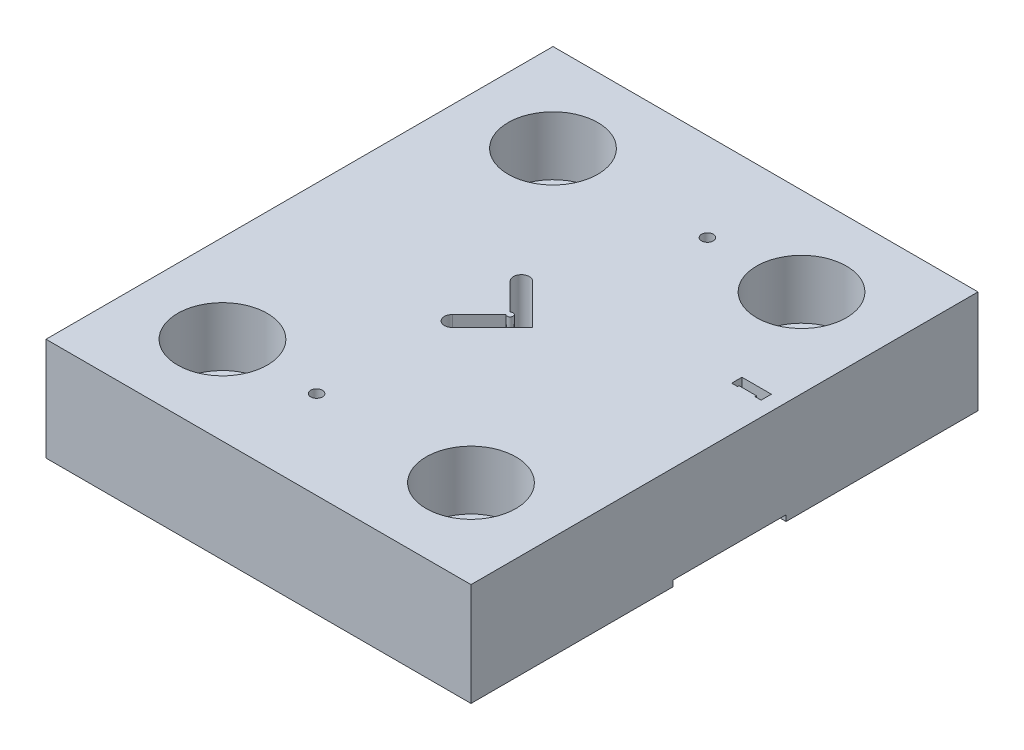
ISO-10303-21;
HEADER;
FILE_DESCRIPTION(('STEP AP214'),'2;1');
FILE_NAME('part.step','',(''),(''),'','','');
FILE_SCHEMA(('AUTOMOTIVE_DESIGN { 1 0 10303 214 1 1 1 1 }'));
ENDSEC;
DATA;
#1=APPLICATION_CONTEXT('core data for automotive mechanical design processes');
#2=APPLICATION_PROTOCOL_DEFINITION('international standard','automotive_design',2000,#1);
#3=PRODUCT_CONTEXT('',#1,'mechanical');
#4=PRODUCT('Part','Part','',(#3));
#5=PRODUCT_RELATED_PRODUCT_CATEGORY('part','',(#4));
#6=PRODUCT_DEFINITION_FORMATION('','',#4);
#7=PRODUCT_DEFINITION_CONTEXT('part definition',#1,'design');
#8=PRODUCT_DEFINITION('design','',#6,#7);
#9=PRODUCT_DEFINITION_SHAPE('','',#8);
#10=(LENGTH_UNIT() NAMED_UNIT(*) SI_UNIT(.MILLI.,.METRE.));
#11=(NAMED_UNIT(*) PLANE_ANGLE_UNIT() SI_UNIT($,.RADIAN.));
#12=(NAMED_UNIT(*) SI_UNIT($,.STERADIAN.) SOLID_ANGLE_UNIT());
#13=UNCERTAINTY_MEASURE_WITH_UNIT(LENGTH_MEASURE(1.E-05),#10,'distance_accuracy_value','');
#14=(GEOMETRIC_REPRESENTATION_CONTEXT(3) GLOBAL_UNCERTAINTY_ASSIGNED_CONTEXT((#13)) GLOBAL_UNIT_ASSIGNED_CONTEXT((#10,
#11,#12)) REPRESENTATION_CONTEXT('',''));
#15=CARTESIAN_POINT('',(0.,0.,0.));
#16=DIRECTION('',(0.,0.,1.));
#17=DIRECTION('',(1.,0.,0.));
#18=AXIS2_PLACEMENT_3D('',#15,#16,#17);
#19=CARTESIAN_POINT('',(42.25,35.001,56.19));
#20=DIRECTION('',(0.,-1.,0.));
#21=DIRECTION('',(0.,0.,-1.));
#22=AXIS2_PLACEMENT_3D('',#19,#20,#21);
#23=CYLINDRICAL_SURFACE('',#22,10.5);
#24=CARTESIAN_POINT('',(42.25,0.,56.19));
#25=DIRECTION('',(0.,-1.,0.));
#26=DIRECTION('',(0.,0.,-1.));
#27=AXIS2_PLACEMENT_3D('',#24,#25,#26);
#28=CIRCLE('',#27,10.5);
#29=CARTESIAN_POINT('',(42.25,0.,45.69));
#30=VERTEX_POINT('',#29);
#31=EDGE_CURVE('E277',#30,#30,#28,.T.);
#32=ORIENTED_EDGE('',*,*,#31,.T.);
#33=EDGE_LOOP('',(#32));
#34=FACE_BOUND('',#33,.T.);
#35=CARTESIAN_POINT('',(42.25,15.,56.19));
#36=DIRECTION('',(0.,1.,0.));
#37=DIRECTION('',(0.,0.,1.));
#38=AXIS2_PLACEMENT_3D('',#35,#36,#37);
#39=CIRCLE('',#38,10.5);
#40=CARTESIAN_POINT('',(42.25,15.,66.69));
#41=VERTEX_POINT('',#40);
#42=EDGE_CURVE('E42',#41,#41,#39,.F.);
#43=ORIENTED_EDGE('',*,*,#42,.F.);
#44=EDGE_LOOP('',(#43));
#45=FACE_BOUND('',#44,.T.);
#46=ADVANCED_FACE('F38',(#34,#45),#23,.F.);
#47=CARTESIAN_POINT('',(-42.25,35.001,56.19));
#48=DIRECTION('',(0.,-1.,0.));
#49=DIRECTION('',(0.,0.,-1.));
#50=AXIS2_PLACEMENT_3D('',#47,#48,#49);
#51=CYLINDRICAL_SURFACE('',#50,10.5);
#52=CARTESIAN_POINT('',(-42.25,0.,56.19));
#53=DIRECTION('',(0.,-1.,0.));
#54=DIRECTION('',(0.,0.,-1.));
#55=AXIS2_PLACEMENT_3D('',#52,#53,#54);
#56=CIRCLE('',#55,10.5);
#57=CARTESIAN_POINT('',(-42.25,0.,45.69));
#58=VERTEX_POINT('',#57);
#59=EDGE_CURVE('E379',#58,#58,#56,.T.);
#60=ORIENTED_EDGE('',*,*,#59,.T.);
#61=EDGE_LOOP('',(#60));
#62=FACE_BOUND('',#61,.T.);
#63=CARTESIAN_POINT('',(-42.25,15.,56.19));
#64=DIRECTION('',(0.,1.,0.));
#65=DIRECTION('',(0.,0.,1.));
#66=AXIS2_PLACEMENT_3D('',#63,#64,#65);
#67=CIRCLE('',#66,10.5);
#68=CARTESIAN_POINT('',(-42.25,15.,66.69));
#69=VERTEX_POINT('',#68);
#70=EDGE_CURVE('E429',#69,#69,#67,.F.);
#71=ORIENTED_EDGE('',*,*,#70,.F.);
#72=EDGE_LOOP('',(#71));
#73=FACE_BOUND('',#72,.T.);
#74=ADVANCED_FACE('F439',(#62,#73),#51,.F.);
#75=CARTESIAN_POINT('',(42.25,35.001,-56.19));
#76=DIRECTION('',(0.,-1.,0.));
#77=DIRECTION('',(0.,0.,-1.));
#78=AXIS2_PLACEMENT_3D('',#75,#76,#77);
#79=CYLINDRICAL_SURFACE('',#78,10.5);
#80=CARTESIAN_POINT('',(42.25,0.,-56.19));
#81=DIRECTION('',(0.,-1.,0.));
#82=DIRECTION('',(0.,0.,-1.));
#83=AXIS2_PLACEMENT_3D('',#80,#81,#82);
#84=CIRCLE('',#83,10.5);
#85=CARTESIAN_POINT('',(42.25,0.,-66.69));
#86=VERTEX_POINT('',#85);
#87=EDGE_CURVE('E376',#86,#86,#84,.T.);
#88=ORIENTED_EDGE('',*,*,#87,.T.);
#89=EDGE_LOOP('',(#88));
#90=FACE_BOUND('',#89,.T.);
#91=CARTESIAN_POINT('',(42.25,15.,-56.19));
#92=DIRECTION('',(0.,1.,0.));
#93=DIRECTION('',(0.,0.,1.));
#94=AXIS2_PLACEMENT_3D('',#91,#92,#93);
#95=CIRCLE('',#94,10.5);
#96=CARTESIAN_POINT('',(42.25,15.,-45.69));
#97=VERTEX_POINT('',#96);
#98=EDGE_CURVE('E426',#97,#97,#95,.F.);
#99=ORIENTED_EDGE('',*,*,#98,.F.);
#100=EDGE_LOOP('',(#99));
#101=FACE_BOUND('',#100,.T.);
#102=ADVANCED_FACE('F445',(#90,#101),#79,.F.);
#103=CARTESIAN_POINT('',(-42.25,35.001,-56.19));
#104=DIRECTION('',(0.,-1.,0.));
#105=DIRECTION('',(0.,0.,-1.));
#106=AXIS2_PLACEMENT_3D('',#103,#104,#105);
#107=CYLINDRICAL_SURFACE('',#106,10.5);
#108=CARTESIAN_POINT('',(-42.25,0.,-56.19));
#109=DIRECTION('',(0.,-1.,0.));
#110=DIRECTION('',(0.,0.,-1.));
#111=AXIS2_PLACEMENT_3D('',#108,#109,#110);
#112=CIRCLE('',#111,10.5);
#113=CARTESIAN_POINT('',(-42.25,0.,-66.69));
#114=VERTEX_POINT('',#113);
#115=EDGE_CURVE('E372',#114,#114,#112,.T.);
#116=ORIENTED_EDGE('',*,*,#115,.T.);
#117=EDGE_LOOP('',(#116));
#118=FACE_BOUND('',#117,.T.);
#119=CARTESIAN_POINT('',(-42.25,15.,-56.19));
#120=DIRECTION('',(0.,1.,0.));
#121=DIRECTION('',(0.,0.,1.));
#122=AXIS2_PLACEMENT_3D('',#119,#120,#121);
#123=CIRCLE('',#122,10.5);
#124=CARTESIAN_POINT('',(-42.25,15.,-45.69));
#125=VERTEX_POINT('',#124);
#126=EDGE_CURVE('E423',#125,#125,#123,.F.);
#127=ORIENTED_EDGE('',*,*,#126,.F.);
#128=EDGE_LOOP('',(#127));
#129=FACE_BOUND('',#128,.T.);
#130=ADVANCED_FACE('F513',(#118,#129),#107,.F.);
#131=CARTESIAN_POINT('',(0.,0.,0.));
#132=DIRECTION('',(0.,-1.,0.));
#133=DIRECTION('',(0.,0.,-1.));
#134=AXIS2_PLACEMENT_3D('',#131,#132,#133);
#135=PLANE('',#134);
#136=DIRECTION('',(-1.,0.,0.));
#137=VECTOR('',#136,1.);
#138=CARTESIAN_POINT('',(-72.25,0.,17.44));
#139=LINE('',#138,#137);
#140=CARTESIAN_POINT('',(72.25,0.,17.44));
#141=VERTEX_POINT('',#140);
#142=CARTESIAN_POINT('',(-72.25,0.,17.44));
#143=VERTEX_POINT('',#142);
#144=EDGE_CURVE('E206',#141,#143,#139,.T.);
#145=ORIENTED_EDGE('',*,*,#144,.F.);
#146=DIRECTION('',(0.,0.,-1.));
#147=VECTOR('',#146,1.);
#148=CARTESIAN_POINT('',(72.25,0.,86.19));
#149=LINE('',#148,#147);
#150=CARTESIAN_POINT('',(72.25,0.,86.19));
#151=VERTEX_POINT('',#150);
#152=EDGE_CURVE('E404',#151,#141,#149,.T.);
#153=ORIENTED_EDGE('',*,*,#152,.F.);
#154=DIRECTION('',(1.,0.,0.));
#155=VECTOR('',#154,1.);
#156=CARTESIAN_POINT('',(-72.25,0.,86.19));
#157=LINE('',#156,#155);
#158=CARTESIAN_POINT('',(-72.25,0.,86.19));
#159=VERTEX_POINT('',#158);
#160=EDGE_CURVE('E397',#159,#151,#157,.T.);
#161=ORIENTED_EDGE('',*,*,#160,.F.);
#162=DIRECTION('',(0.,0.,1.));
#163=VECTOR('',#162,1.);
#164=CARTESIAN_POINT('',(-72.25,0.,86.19));
#165=LINE('',#164,#163);
#166=EDGE_CURVE('E409',#143,#159,#165,.T.);
#167=ORIENTED_EDGE('',*,*,#166,.F.);
#168=EDGE_LOOP('',(#145,#153,#161,#167));
#169=FACE_BOUND('',#168,.T.);
#170=ORIENTED_EDGE('',*,*,#31,.F.);
#171=EDGE_LOOP('',(#170));
#172=FACE_BOUND('',#171,.T.);
#173=CARTESIAN_POINT('',(-10.25,0.,56.19));
#174=DIRECTION('',(0.,-1.,0.));
#175=DIRECTION('',(0.,0.,-1.));
#176=AXIS2_PLACEMENT_3D('',#173,#174,#175);
#177=CIRCLE('',#176,1.99);
#178=CARTESIAN_POINT('',(-10.25,0.,54.2));
#179=VERTEX_POINT('',#178);
#180=EDGE_CURVE('E280',#179,#179,#177,.T.);
#181=ORIENTED_EDGE('',*,*,#180,.F.);
#182=EDGE_LOOP('',(#181));
#183=FACE_BOUND('',#182,.T.);
#184=ORIENTED_EDGE('',*,*,#59,.F.);
#185=EDGE_LOOP('',(#184));
#186=FACE_BOUND('',#185,.T.);
#187=ADVANCED_FACE('F516',(#169,#172,#183,#186),#135,.T.);
#188=CARTESIAN_POINT('',(72.25,35.,86.19));
#189=DIRECTION('',(-1.,0.,0.));
#190=DIRECTION('',(0.,0.,1.));
#191=AXIS2_PLACEMENT_3D('',#188,#189,#190);
#192=PLANE('',#191);
#193=ORIENTED_EDGE('',*,*,#152,.T.);
#194=DIRECTION('',(0.,-1.,0.));
#195=VECTOR('',#194,1.);
#196=CARTESIAN_POINT('',(72.25,2.,17.44));
#197=LINE('',#196,#195);
#198=CARTESIAN_POINT('',(72.25,2.,17.44));
#199=VERTEX_POINT('',#198);
#200=EDGE_CURVE('E233',#199,#141,#197,.T.);
#201=ORIENTED_EDGE('',*,*,#200,.F.);
#202=DIRECTION('',(0.,0.,1.));
#203=VECTOR('',#202,1.);
#204=CARTESIAN_POINT('',(72.25,2.,-19.6447272925535));
#205=LINE('',#204,#203);
#206=CARTESIAN_POINT('',(72.25,2.,-20.94));
#207=VERTEX_POINT('',#206);
#208=EDGE_CURVE('E211',#207,#199,#205,.T.);
#209=ORIENTED_EDGE('',*,*,#208,.F.);
#210=DIRECTION('',(0.,-1.,0.));
#211=VECTOR('',#210,1.);
#212=CARTESIAN_POINT('',(72.25,2.,-20.94));
#213=LINE('',#212,#211);
#214=CARTESIAN_POINT('',(72.25,0.,-20.94));
#215=VERTEX_POINT('',#214);
#216=EDGE_CURVE('E235',#207,#215,#213,.T.);
#217=ORIENTED_EDGE('',*,*,#216,.T.);
#218=CARTESIAN_POINT('',(72.25,0.,-86.19));
#219=VERTEX_POINT('',#218);
#220=EDGE_CURVE('E392',#215,#219,#149,.T.);
#221=ORIENTED_EDGE('',*,*,#220,.T.);
#222=DIRECTION('',(0.,-1.,0.));
#223=VECTOR('',#222,1.);
#224=CARTESIAN_POINT('',(72.25,35.,-86.19));
#225=LINE('',#224,#223);
#226=CARTESIAN_POINT('',(72.25,35.,-86.19));
#227=VERTEX_POINT('',#226);
#228=EDGE_CURVE('E47',#227,#219,#225,.T.);
#229=ORIENTED_EDGE('',*,*,#228,.F.);
#230=DIRECTION('',(0.,0.,-1.));
#231=VECTOR('',#230,1.);
#232=CARTESIAN_POINT('',(72.25,35.,86.19));
#233=LINE('',#232,#231);
#234=CARTESIAN_POINT('',(72.25,35.,86.19));
#235=VERTEX_POINT('',#234);
#236=EDGE_CURVE('E393',#235,#227,#233,.T.);
#237=ORIENTED_EDGE('',*,*,#236,.F.);
#238=DIRECTION('',(0.,-1.,0.));
#239=VECTOR('',#238,1.);
#240=CARTESIAN_POINT('',(72.25,35.,86.19));
#241=LINE('',#240,#239);
#242=EDGE_CURVE('E403',#235,#151,#241,.T.);
#243=ORIENTED_EDGE('',*,*,#242,.T.);
#244=EDGE_LOOP('',(#193,#201,#209,#217,#221,#229,#237,#243));
#245=FACE_BOUND('',#244,.T.);
#246=ADVANCED_FACE('F40',(#245),#192,.F.);
#247=CARTESIAN_POINT('',(-72.25,35.,-86.19));
#248=DIRECTION('',(0.,0.,1.));
#249=DIRECTION('',(1.,0.,0.));
#250=AXIS2_PLACEMENT_3D('',#247,#248,#249);
#251=PLANE('',#250);
#252=DIRECTION('',(-1.,0.,0.));
#253=VECTOR('',#252,1.);
#254=CARTESIAN_POINT('',(-72.25,0.,-86.19));
#255=LINE('',#254,#253);
#256=CARTESIAN_POINT('',(-72.25,0.,-86.19));
#257=VERTEX_POINT('',#256);
#258=EDGE_CURVE('E407',#219,#257,#255,.T.);
#259=ORIENTED_EDGE('',*,*,#258,.T.);
#260=DIRECTION('',(0.,-1.,0.));
#261=VECTOR('',#260,1.);
#262=CARTESIAN_POINT('',(-72.25,35.,-86.19));
#263=LINE('',#262,#261);
#264=CARTESIAN_POINT('',(-72.25,35.,-86.19));
#265=VERTEX_POINT('',#264);
#266=EDGE_CURVE('E418',#265,#257,#263,.T.);
#267=ORIENTED_EDGE('',*,*,#266,.F.);
#268=DIRECTION('',(-1.,0.,0.));
#269=VECTOR('',#268,1.);
#270=CARTESIAN_POINT('',(-72.25,35.,-86.19));
#271=LINE('',#270,#269);
#272=EDGE_CURVE('E396',#227,#265,#271,.T.);
#273=ORIENTED_EDGE('',*,*,#272,.F.);
#274=ORIENTED_EDGE('',*,*,#228,.T.);
#275=EDGE_LOOP('',(#259,#267,#273,#274));
#276=FACE_BOUND('',#275,.T.);
#277=ADVANCED_FACE('F540',(#276),#251,.F.);
#278=CARTESIAN_POINT('',(-72.25,35.,86.19));
#279=DIRECTION('',(1.,0.,0.));
#280=DIRECTION('',(0.,0.,-1.));
#281=AXIS2_PLACEMENT_3D('',#278,#279,#280);
#282=PLANE('',#281);
#283=DIRECTION('',(0.,0.,-1.));
#284=VECTOR('',#283,1.);
#285=CARTESIAN_POINT('',(-72.25,2.,17.44));
#286=LINE('',#285,#284);
#287=CARTESIAN_POINT('',(-72.25,2.,17.44));
#288=VERTEX_POINT('',#287);
#289=CARTESIAN_POINT('',(-72.25,2.,-17.94));
#290=VERTEX_POINT('',#289);
#291=EDGE_CURVE('E216',#288,#290,#286,.T.);
#292=ORIENTED_EDGE('',*,*,#291,.F.);
#293=DIRECTION('',(0.,-1.,0.));
#294=VECTOR('',#293,1.);
#295=CARTESIAN_POINT('',(-72.25,2.,17.44));
#296=LINE('',#295,#294);
#297=EDGE_CURVE('E200',#288,#143,#296,.T.);
#298=ORIENTED_EDGE('',*,*,#297,.T.);
#299=ORIENTED_EDGE('',*,*,#166,.T.);
#300=DIRECTION('',(0.,-1.,0.));
#301=VECTOR('',#300,1.);
#302=CARTESIAN_POINT('',(-72.25,35.,86.19));
#303=LINE('',#302,#301);
#304=CARTESIAN_POINT('',(-72.25,35.,86.19));
#305=VERTEX_POINT('',#304);
#306=EDGE_CURVE('E415',#305,#159,#303,.T.);
#307=ORIENTED_EDGE('',*,*,#306,.F.);
#308=DIRECTION('',(0.,0.,1.));
#309=VECTOR('',#308,1.);
#310=CARTESIAN_POINT('',(-72.25,35.,86.19));
#311=LINE('',#310,#309);
#312=EDGE_CURVE('E399',#265,#305,#311,.T.);
#313=ORIENTED_EDGE('',*,*,#312,.F.);
#314=ORIENTED_EDGE('',*,*,#266,.T.);
#315=CARTESIAN_POINT('',(-72.25,0.,-17.94));
#316=VERTEX_POINT('',#315);
#317=EDGE_CURVE('E410',#257,#316,#165,.T.);
#318=ORIENTED_EDGE('',*,*,#317,.T.);
#319=DIRECTION('',(0.,-1.,0.));
#320=VECTOR('',#319,1.);
#321=CARTESIAN_POINT('',(-72.25,2.,-17.94));
#322=LINE('',#321,#320);
#323=EDGE_CURVE('E210',#290,#316,#322,.T.);
#324=ORIENTED_EDGE('',*,*,#323,.F.);
#325=EDGE_LOOP('',(#292,#298,#299,#307,#313,#314,#318,#324));
#326=FACE_BOUND('',#325,.T.);
#327=ADVANCED_FACE('F221',(#326),#282,.F.);
#328=CARTESIAN_POINT('',(-72.25,35.,86.19));
#329=DIRECTION('',(0.,0.,-1.));
#330=DIRECTION('',(-1.,0.,0.));
#331=AXIS2_PLACEMENT_3D('',#328,#329,#330);
#332=PLANE('',#331);
#333=ORIENTED_EDGE('',*,*,#160,.T.);
#334=ORIENTED_EDGE('',*,*,#242,.F.);
#335=DIRECTION('',(1.,0.,0.));
#336=VECTOR('',#335,1.);
#337=CARTESIAN_POINT('',(-72.25,35.,86.19));
#338=LINE('',#337,#336);
#339=EDGE_CURVE('E401',#305,#235,#338,.T.);
#340=ORIENTED_EDGE('',*,*,#339,.F.);
#341=ORIENTED_EDGE('',*,*,#306,.T.);
#342=EDGE_LOOP('',(#333,#334,#340,#341));
#343=FACE_BOUND('',#342,.T.);
#344=ADVANCED_FACE('F531',(#343),#332,.F.);
#345=CARTESIAN_POINT('',(0.,35.,0.));
#346=DIRECTION('',(0.,-1.,0.));
#347=DIRECTION('',(0.,0.,-1.));
#348=AXIS2_PLACEMENT_3D('',#345,#346,#347);
#349=PLANE('',#348);
#350=CARTESIAN_POINT('',(-42.25,35.,56.19));
#351=DIRECTION('',(0.,1.,0.));
#352=DIRECTION('',(0.,0.,1.));
#353=AXIS2_PLACEMENT_3D('',#350,#351,#352);
#354=CIRCLE('',#353,15.25);
#355=CARTESIAN_POINT('',(-42.25,35.,71.44));
#356=VERTEX_POINT('',#355);
#357=EDGE_CURVE('E851',#356,#356,#354,.T.);
#358=ORIENTED_EDGE('',*,*,#357,.F.);
#359=EDGE_LOOP('',(#358));
#360=FACE_BOUND('',#359,.T.);
#361=CARTESIAN_POINT('',(42.25,35.,56.19));
#362=DIRECTION('',(0.,1.,0.));
#363=DIRECTION('',(0.,0.,1.));
#364=AXIS2_PLACEMENT_3D('',#361,#362,#363);
#365=CIRCLE('',#364,15.25);
#366=CARTESIAN_POINT('',(42.25,35.,71.44));
#367=VERTEX_POINT('',#366);
#368=EDGE_CURVE('E844',#367,#367,#365,.T.);
#369=ORIENTED_EDGE('',*,*,#368,.F.);
#370=EDGE_LOOP('',(#369));
#371=FACE_BOUND('',#370,.T.);
#372=CARTESIAN_POINT('',(42.25,35.,-56.19));
#373=DIRECTION('',(0.,1.,0.));
#374=DIRECTION('',(0.,0.,1.));
#375=AXIS2_PLACEMENT_3D('',#372,#373,#374);
#376=CIRCLE('',#375,15.25);
#377=CARTESIAN_POINT('',(42.25,35.,-40.94));
#378=VERTEX_POINT('',#377);
#379=EDGE_CURVE('E848',#378,#378,#376,.T.);
#380=ORIENTED_EDGE('',*,*,#379,.F.);
#381=EDGE_LOOP('',(#380));
#382=FACE_BOUND('',#381,.T.);
#383=CARTESIAN_POINT('',(-42.25,35.,-56.19));
#384=DIRECTION('',(0.,1.,0.));
#385=DIRECTION('',(0.,0.,1.));
#386=AXIS2_PLACEMENT_3D('',#383,#384,#385);
#387=CIRCLE('',#386,15.25);
#388=CARTESIAN_POINT('',(-42.25,35.,-40.94));
#389=VERTEX_POINT('',#388);
#390=EDGE_CURVE('E858',#389,#389,#387,.T.);
#391=ORIENTED_EDGE('',*,*,#390,.F.);
#392=EDGE_LOOP('',(#391));
#393=FACE_BOUND('',#392,.T.);
#394=CARTESIAN_POINT('',(-10.25,35.,56.19));
#395=DIRECTION('',(0.,-1.,0.));
#396=DIRECTION('',(0.,0.,-1.));
#397=AXIS2_PLACEMENT_3D('',#394,#395,#396);
#398=CIRCLE('',#397,1.99);
#399=CARTESIAN_POINT('',(-10.25,35.,54.2));
#400=VERTEX_POINT('',#399);
#401=EDGE_CURVE('E382',#400,#400,#398,.F.);
#402=ORIENTED_EDGE('',*,*,#401,.F.);
#403=EDGE_LOOP('',(#402));
#404=FACE_BOUND('',#403,.T.);
#405=DIRECTION('',(-1.,0.,0.));
#406=VECTOR('',#405,1.);
#407=CARTESIAN_POINT('',(57.25,35.,-20.94));
#408=LINE('',#407,#406);
#409=CARTESIAN_POINT('',(67.25,35.,-20.94));
#410=VERTEX_POINT('',#409);
#411=CARTESIAN_POINT('',(57.25,35.,-20.94));
#412=VERTEX_POINT('',#411);
#413=EDGE_CURVE('E297',#410,#412,#408,.T.);
#414=ORIENTED_EDGE('',*,*,#413,.F.);
#415=DIRECTION('',(0.,0.,-1.));
#416=VECTOR('',#415,1.);
#417=CARTESIAN_POINT('',(67.25,35.,-20.94));
#418=LINE('',#417,#416);
#419=CARTESIAN_POINT('',(67.25,35.,-17.44));
#420=VERTEX_POINT('',#419);
#421=EDGE_CURVE('E300',#420,#410,#418,.T.);
#422=ORIENTED_EDGE('',*,*,#421,.F.);
#423=DIRECTION('',(1.,0.,0.));
#424=VECTOR('',#423,1.);
#425=CARTESIAN_POINT('',(67.25,35.,-17.44));
#426=LINE('',#425,#424);
#427=CARTESIAN_POINT('',(65.25,35.,-17.44));
#428=VERTEX_POINT('',#427);
#429=EDGE_CURVE('E281',#428,#420,#426,.T.);
#430=ORIENTED_EDGE('',*,*,#429,.F.);
#431=DIRECTION('',(0.,0.,1.));
#432=VECTOR('',#431,1.);
#433=CARTESIAN_POINT('',(65.25,35.,-17.44));
#434=LINE('',#433,#432);
#435=CARTESIAN_POINT('',(65.25,35.,-17.94));
#436=VERTEX_POINT('',#435);
#437=EDGE_CURVE('E282',#436,#428,#434,.T.);
#438=ORIENTED_EDGE('',*,*,#437,.F.);
#439=DIRECTION('',(1.,0.,0.));
#440=VECTOR('',#439,1.);
#441=CARTESIAN_POINT('',(65.25,35.,-17.94));
#442=LINE('',#441,#440);
#443=CARTESIAN_POINT('',(59.25,35.,-17.94));
#444=VERTEX_POINT('',#443);
#445=EDGE_CURVE('E284',#444,#436,#442,.T.);
#446=ORIENTED_EDGE('',*,*,#445,.F.);
#447=DIRECTION('',(0.,0.,-1.));
#448=VECTOR('',#447,1.);
#449=CARTESIAN_POINT('',(59.25,35.,-17.94));
#450=LINE('',#449,#448);
#451=CARTESIAN_POINT('',(59.25,35.,-17.44));
#452=VERTEX_POINT('',#451);
#453=EDGE_CURVE('E288',#452,#444,#450,.T.);
#454=ORIENTED_EDGE('',*,*,#453,.F.);
#455=DIRECTION('',(1.,0.,0.));
#456=VECTOR('',#455,1.);
#457=CARTESIAN_POINT('',(59.25,35.,-17.44));
#458=LINE('',#457,#456);
#459=CARTESIAN_POINT('',(57.25,35.,-17.44));
#460=VERTEX_POINT('',#459);
#461=EDGE_CURVE('E291',#460,#452,#458,.T.);
#462=ORIENTED_EDGE('',*,*,#461,.F.);
#463=DIRECTION('',(0.,0.,1.));
#464=VECTOR('',#463,1.);
#465=CARTESIAN_POINT('',(57.25,35.,-17.44));
#466=LINE('',#465,#464);
#467=EDGE_CURVE('E294',#412,#460,#466,.T.);
#468=ORIENTED_EDGE('',*,*,#467,.F.);
#469=EDGE_LOOP('',(#414,#422,#430,#438,#446,#454,#462,#468));
#470=FACE_BOUND('',#469,.T.);
#471=DIRECTION('',(0.707106781186548,0.,0.707106781186547));
#472=VECTOR('',#471,1.);
#473=CARTESIAN_POINT('',(-1.33386001800125,35.,-0.707106781186571));
#474=LINE('',#473,#472);
#475=CARTESIAN_POINT('',(-10.4555374953077,35.,-9.82878425849303));
#476=VERTEX_POINT('',#475);
#477=CARTESIAN_POINT('',(-1.33386001800125,35.,-0.707106781186571));
#478=VERTEX_POINT('',#477);
#479=EDGE_CURVE('E343',#476,#478,#474,.T.);
#480=ORIENTED_EDGE('',*,*,#479,.F.);
#481=CARTESIAN_POINT('',(-8.54634918610403,35.,-11.7379725676967));
#482=DIRECTION('',(0.,-1.,0.));
#483=DIRECTION('',(0.,0.,-1.));
#484=AXIS2_PLACEMENT_3D('',#481,#482,#483);
#485=CIRCLE('',#484,2.7);
#486=CARTESIAN_POINT('',(-6.63716087690035,35.,-13.6471608769004));
#487=VERTEX_POINT('',#486);
#488=EDGE_CURVE('E346',#487,#476,#485,.F.);
#489=ORIENTED_EDGE('',*,*,#488,.F.);
#490=DIRECTION('',(-0.707106781186548,0.,-0.707106781186548));
#491=VECTOR('',#490,1.);
#492=CARTESIAN_POINT('',(-6.63716087690035,35.,-13.6471608769004));
#493=LINE('',#492,#491);
#494=CARTESIAN_POINT('',(7.01000000000001,35.,0.));
#495=VERTEX_POINT('',#494);
#496=EDGE_CURVE('E285',#495,#487,#493,.T.);
#497=ORIENTED_EDGE('',*,*,#496,.F.);
#498=DIRECTION('',(0.707106781186548,0.,-0.707106781186547));
#499=VECTOR('',#498,1.);
#500=CARTESIAN_POINT('',(7.01000000000001,35.,0.));
#501=LINE('',#500,#499);
#502=CARTESIAN_POINT('',(-6.63716087690036,35.,13.6471608769003));
#503=VERTEX_POINT('',#502);
#504=EDGE_CURVE('E276',#503,#495,#501,.T.);
#505=ORIENTED_EDGE('',*,*,#504,.F.);
#506=CARTESIAN_POINT('',(-8.54634918610403,35.,11.7379725676967));
#507=DIRECTION('',(0.,-1.,0.));
#508=DIRECTION('',(0.,0.,-1.));
#509=AXIS2_PLACEMENT_3D('',#506,#507,#508);
#510=CIRCLE('',#509,2.7);
#511=CARTESIAN_POINT('',(-10.4555374953077,35.,9.82878425849299));
#512=VERTEX_POINT('',#511);
#513=EDGE_CURVE('E334',#512,#503,#510,.F.);
#514=ORIENTED_EDGE('',*,*,#513,.F.);
#515=DIRECTION('',(-0.707106781186547,0.,0.707106781186548));
#516=VECTOR('',#515,1.);
#517=CARTESIAN_POINT('',(-10.4555374953077,35.,9.82878425849299));
#518=LINE('',#517,#516);
#519=CARTESIAN_POINT('',(-1.33386001800125,35.,0.707106781186524));
#520=VERTEX_POINT('',#519);
#521=EDGE_CURVE('E337',#520,#512,#518,.T.);
#522=ORIENTED_EDGE('',*,*,#521,.F.);
#523=CARTESIAN_POINT('',(-0.626753236814704,35.,0.));
#524=DIRECTION('',(0.,-1.,0.));
#525=DIRECTION('',(0.,0.,-1.));
#526=AXIS2_PLACEMENT_3D('',#523,#524,#525);
#527=CIRCLE('',#526,1.);
#528=EDGE_CURVE('E340',#478,#520,#527,.T.);
#529=ORIENTED_EDGE('',*,*,#528,.F.);
#530=EDGE_LOOP('',(#480,#489,#497,#505,#514,#522,#529));
#531=FACE_BOUND('',#530,.T.);
#532=CARTESIAN_POINT('',(10.25,35.,-56.19));
#533=DIRECTION('',(0.,-1.,0.));
#534=DIRECTION('',(0.,0.,-1.));
#535=AXIS2_PLACEMENT_3D('',#532,#533,#534);
#536=CIRCLE('',#535,1.99);
#537=CARTESIAN_POINT('',(10.25,35.,-58.18));
#538=VERTEX_POINT('',#537);
#539=EDGE_CURVE('E389',#538,#538,#536,.F.);
#540=ORIENTED_EDGE('',*,*,#539,.F.);
#541=EDGE_LOOP('',(#540));
#542=FACE_BOUND('',#541,.T.);
#543=ORIENTED_EDGE('',*,*,#236,.T.);
#544=ORIENTED_EDGE('',*,*,#272,.T.);
#545=ORIENTED_EDGE('',*,*,#312,.T.);
#546=ORIENTED_EDGE('',*,*,#339,.T.);
#547=EDGE_LOOP('',(#543,#544,#545,#546));
#548=FACE_BOUND('',#547,.T.);
#549=ADVANCED_FACE('F528',(#360,#371,#382,#393,#404,#470,#531,#542,#548),#349,.F.);
#550=ORIENTED_EDGE('',*,*,#220,.F.);
#551=DIRECTION('',(1.,0.,0.));
#552=VECTOR('',#551,1.);
#553=CARTESIAN_POINT('',(57.25,0.,-20.94));
#554=LINE('',#553,#552);
#555=CARTESIAN_POINT('',(57.25,0.,-20.94));
#556=VERTEX_POINT('',#555);
#557=EDGE_CURVE('E306',#556,#215,#554,.T.);
#558=ORIENTED_EDGE('',*,*,#557,.F.);
#559=DIRECTION('',(0.,0.,-1.));
#560=VECTOR('',#559,1.);
#561=CARTESIAN_POINT('',(57.25,0.,-17.44));
#562=LINE('',#561,#560);
#563=CARTESIAN_POINT('',(57.25,0.,-17.94));
#564=VERTEX_POINT('',#563);
#565=EDGE_CURVE('E303',#564,#556,#562,.T.);
#566=ORIENTED_EDGE('',*,*,#565,.F.);
#567=DIRECTION('',(1.,0.,0.));
#568=VECTOR('',#567,1.);
#569=CARTESIAN_POINT('',(-72.25,0.,-17.94));
#570=LINE('',#569,#568);
#571=EDGE_CURVE('E219',#316,#564,#570,.T.);
#572=ORIENTED_EDGE('',*,*,#571,.F.);
#573=ORIENTED_EDGE('',*,*,#317,.F.);
#574=ORIENTED_EDGE('',*,*,#258,.F.);
#575=EDGE_LOOP('',(#550,#558,#566,#572,#573,#574));
#576=FACE_BOUND('',#575,.T.);
#577=ORIENTED_EDGE('',*,*,#115,.F.);
#578=EDGE_LOOP('',(#577));
#579=FACE_BOUND('',#578,.T.);
#580=ORIENTED_EDGE('',*,*,#87,.F.);
#581=EDGE_LOOP('',(#580));
#582=FACE_BOUND('',#581,.T.);
#583=CARTESIAN_POINT('',(10.25,0.,-56.19));
#584=DIRECTION('',(0.,-1.,0.));
#585=DIRECTION('',(0.,0.,-1.));
#586=AXIS2_PLACEMENT_3D('',#583,#584,#585);
#587=CIRCLE('',#586,1.99);
#588=CARTESIAN_POINT('',(10.25,0.,-58.18));
#589=VERTEX_POINT('',#588);
#590=EDGE_CURVE('E375',#589,#589,#587,.T.);
#591=ORIENTED_EDGE('',*,*,#590,.F.);
#592=EDGE_LOOP('',(#591));
#593=FACE_BOUND('',#592,.T.);
#594=ADVANCED_FACE('F526',(#576,#579,#582,#593),#135,.T.);
#595=CARTESIAN_POINT('',(10.25,35.001,-56.19));
#596=DIRECTION('',(0.,-1.,0.));
#597=DIRECTION('',(0.,0.,-1.));
#598=AXIS2_PLACEMENT_3D('',#595,#596,#597);
#599=CYLINDRICAL_SURFACE('',#598,1.99);
#600=ORIENTED_EDGE('',*,*,#590,.T.);
#601=EDGE_LOOP('',(#600));
#602=FACE_BOUND('',#601,.T.);
#603=ORIENTED_EDGE('',*,*,#539,.T.);
#604=EDGE_LOOP('',(#603));
#605=FACE_BOUND('',#604,.T.);
#606=ADVANCED_FACE('F511',(#602,#605),#599,.F.);
#607=CARTESIAN_POINT('',(-8.54634918610403,35.001,-11.7379725676967));
#608=DIRECTION('',(0.,-1.,0.));
#609=DIRECTION('',(0.,0.,-1.));
#610=AXIS2_PLACEMENT_3D('',#607,#608,#609);
#611=CYLINDRICAL_SURFACE('',#610,2.7);
#612=DIRECTION('',(0.,-1.,0.));
#613=VECTOR('',#612,1.);
#614=CARTESIAN_POINT('',(-10.4555374953077,35.001,-9.82878425849303));
#615=LINE('',#614,#613);
#616=CARTESIAN_POINT('',(-10.4555374953077,2.,-9.82878425849303));
#617=VERTEX_POINT('',#616);
#618=EDGE_CURVE('E350',#476,#617,#615,.T.);
#619=ORIENTED_EDGE('',*,*,#618,.T.);
#620=CARTESIAN_POINT('',(-8.54634918610403,2.,-11.7379725676967));
#621=DIRECTION('',(0.,1.,0.));
#622=DIRECTION('',(0.,0.,1.));
#623=AXIS2_PLACEMENT_3D('',#620,#621,#622);
#624=CIRCLE('',#623,2.7);
#625=CARTESIAN_POINT('',(-6.63716087690035,2.,-13.6471608769004));
#626=VERTEX_POINT('',#625);
#627=EDGE_CURVE('E273',#617,#626,#624,.F.);
#628=ORIENTED_EDGE('',*,*,#627,.T.);
#629=DIRECTION('',(0.,-1.,0.));
#630=VECTOR('',#629,1.);
#631=CARTESIAN_POINT('',(-6.63716087690035,35.001,-13.6471608769004));
#632=LINE('',#631,#630);
#633=EDGE_CURVE('E349',#487,#626,#632,.T.);
#634=ORIENTED_EDGE('',*,*,#633,.F.);
#635=ORIENTED_EDGE('',*,*,#488,.T.);
#636=EDGE_LOOP('',(#619,#628,#634,#635));
#637=FACE_BOUND('',#636,.T.);
#638=ADVANCED_FACE('F489',(#637),#611,.F.);
#639=CARTESIAN_POINT('',(-1.33386001800125,35.001,-0.707106781186571));
#640=DIRECTION('',(-0.707106781186547,0.,0.707106781186548));
#641=DIRECTION('',(0.707106781186548,0.,0.707106781186547));
#642=AXIS2_PLACEMENT_3D('',#639,#640,#641);
#643=PLANE('',#642);
#644=DIRECTION('',(0.,-1.,0.));
#645=VECTOR('',#644,1.);
#646=CARTESIAN_POINT('',(-1.33386001800125,35.001,-0.707106781186571));
#647=LINE('',#646,#645);
#648=CARTESIAN_POINT('',(-1.33386001800125,2.,-0.707106781186571));
#649=VERTEX_POINT('',#648);
#650=EDGE_CURVE('E353',#478,#649,#647,.T.);
#651=ORIENTED_EDGE('',*,*,#650,.T.);
#652=DIRECTION('',(-0.707106781186548,0.,-0.707106781186547));
#653=VECTOR('',#652,1.);
#654=CARTESIAN_POINT('',(-1.33386001800125,2.,-0.707106781186571));
#655=LINE('',#654,#653);
#656=EDGE_CURVE('E270',#649,#617,#655,.T.);
#657=ORIENTED_EDGE('',*,*,#656,.T.);
#658=ORIENTED_EDGE('',*,*,#618,.F.);
#659=ORIENTED_EDGE('',*,*,#479,.T.);
#660=EDGE_LOOP('',(#651,#657,#658,#659));
#661=FACE_BOUND('',#660,.T.);
#662=ADVANCED_FACE('F485',(#661),#643,.F.);
#663=CARTESIAN_POINT('',(-0.626753236814704,35.001,0.));
#664=DIRECTION('',(0.,-1.,0.));
#665=DIRECTION('',(0.,0.,-1.));
#666=AXIS2_PLACEMENT_3D('',#663,#664,#665);
#667=CYLINDRICAL_SURFACE('',#666,1.);
#668=DIRECTION('',(0.,-1.,0.));
#669=VECTOR('',#668,1.);
#670=CARTESIAN_POINT('',(-1.33386001800125,35.001,0.707106781186524));
#671=LINE('',#670,#669);
#672=CARTESIAN_POINT('',(-1.33386001800125,2.,0.707106781186524));
#673=VERTEX_POINT('',#672);
#674=EDGE_CURVE('E356',#520,#673,#671,.T.);
#675=ORIENTED_EDGE('',*,*,#674,.T.);
#676=CARTESIAN_POINT('',(-0.626753236814704,2.,0.));
#677=DIRECTION('',(0.,1.,0.));
#678=DIRECTION('',(0.,0.,1.));
#679=AXIS2_PLACEMENT_3D('',#676,#677,#678);
#680=CIRCLE('',#679,1.);
#681=EDGE_CURVE('E267',#673,#649,#680,.T.);
#682=ORIENTED_EDGE('',*,*,#681,.T.);
#683=ORIENTED_EDGE('',*,*,#650,.F.);
#684=ORIENTED_EDGE('',*,*,#528,.T.);
#685=EDGE_LOOP('',(#675,#682,#683,#684));
#686=FACE_BOUND('',#685,.T.);
#687=ADVANCED_FACE('F488',(#686),#667,.T.);
#688=CARTESIAN_POINT('',(-10.4555374953077,35.001,9.82878425849299));
#689=DIRECTION('',(-0.707106781186548,0.,-0.707106781186547));
#690=DIRECTION('',(-0.707106781186547,0.,0.707106781186548));
#691=AXIS2_PLACEMENT_3D('',#688,#689,#690);
#692=PLANE('',#691);
#693=DIRECTION('',(0.,-1.,0.));
#694=VECTOR('',#693,1.);
#695=CARTESIAN_POINT('',(-10.4555374953077,35.001,9.82878425849299));
#696=LINE('',#695,#694);
#697=CARTESIAN_POINT('',(-10.4555374953077,2.,9.82878425849299));
#698=VERTEX_POINT('',#697);
#699=EDGE_CURVE('E359',#512,#698,#696,.T.);
#700=ORIENTED_EDGE('',*,*,#699,.T.);
#701=DIRECTION('',(0.707106781186547,0.,-0.707106781186548));
#702=VECTOR('',#701,1.);
#703=CARTESIAN_POINT('',(-10.4555374953077,2.,9.82878425849299));
#704=LINE('',#703,#702);
#705=EDGE_CURVE('E264',#698,#673,#704,.T.);
#706=ORIENTED_EDGE('',*,*,#705,.T.);
#707=ORIENTED_EDGE('',*,*,#674,.F.);
#708=ORIENTED_EDGE('',*,*,#521,.T.);
#709=EDGE_LOOP('',(#700,#706,#707,#708));
#710=FACE_BOUND('',#709,.T.);
#711=ADVANCED_FACE('F493',(#710),#692,.F.);
#712=CARTESIAN_POINT('',(-8.54634918610403,35.001,11.7379725676967));
#713=DIRECTION('',(0.,-1.,0.));
#714=DIRECTION('',(0.,0.,-1.));
#715=AXIS2_PLACEMENT_3D('',#712,#713,#714);
#716=CYLINDRICAL_SURFACE('',#715,2.7);
#717=DIRECTION('',(0.,-1.,0.));
#718=VECTOR('',#717,1.);
#719=CARTESIAN_POINT('',(-6.63716087690036,35.001,13.6471608769003));
#720=LINE('',#719,#718);
#721=CARTESIAN_POINT('',(-6.63716087690035,2.,13.6471608769003));
#722=VERTEX_POINT('',#721);
#723=EDGE_CURVE('E362',#503,#722,#720,.T.);
#724=ORIENTED_EDGE('',*,*,#723,.T.);
#725=CARTESIAN_POINT('',(-8.54634918610403,2.,11.7379725676967));
#726=DIRECTION('',(0.,1.,0.));
#727=DIRECTION('',(0.,0.,1.));
#728=AXIS2_PLACEMENT_3D('',#725,#726,#727);
#729=CIRCLE('',#728,2.7);
#730=EDGE_CURVE('E261',#722,#698,#729,.F.);
#731=ORIENTED_EDGE('',*,*,#730,.T.);
#732=ORIENTED_EDGE('',*,*,#699,.F.);
#733=ORIENTED_EDGE('',*,*,#513,.T.);
#734=EDGE_LOOP('',(#724,#731,#732,#733));
#735=FACE_BOUND('',#734,.T.);
#736=ADVANCED_FACE('F497',(#735),#716,.F.);
#737=CARTESIAN_POINT('',(7.01000000000001,35.001,0.));
#738=DIRECTION('',(0.707106781186547,0.,0.707106781186548));
#739=DIRECTION('',(0.707106781186548,0.,-0.707106781186547));
#740=AXIS2_PLACEMENT_3D('',#737,#738,#739);
#741=PLANE('',#740);
#742=DIRECTION('',(0.,-1.,0.));
#743=VECTOR('',#742,1.);
#744=CARTESIAN_POINT('',(7.01000000000001,35.001,0.));
#745=LINE('',#744,#743);
#746=CARTESIAN_POINT('',(7.01000000000001,2.,0.));
#747=VERTEX_POINT('',#746);
#748=EDGE_CURVE('E365',#495,#747,#745,.T.);
#749=ORIENTED_EDGE('',*,*,#748,.T.);
#750=DIRECTION('',(-0.707106781186548,0.,0.707106781186547));
#751=VECTOR('',#750,1.);
#752=CARTESIAN_POINT('',(7.01000000000001,2.,0.));
#753=LINE('',#752,#751);
#754=EDGE_CURVE('E55',#747,#722,#753,.T.);
#755=ORIENTED_EDGE('',*,*,#754,.T.);
#756=ORIENTED_EDGE('',*,*,#723,.F.);
#757=ORIENTED_EDGE('',*,*,#504,.T.);
#758=EDGE_LOOP('',(#749,#755,#756,#757));
#759=FACE_BOUND('',#758,.T.);
#760=ADVANCED_FACE('F501',(#759),#741,.F.);
#761=CARTESIAN_POINT('',(-6.63716087690035,35.001,-13.6471608769004));
#762=DIRECTION('',(0.707106781186548,0.,-0.707106781186548));
#763=DIRECTION('',(-0.707106781186548,0.,-0.707106781186548));
#764=AXIS2_PLACEMENT_3D('',#761,#762,#763);
#765=PLANE('',#764);
#766=ORIENTED_EDGE('',*,*,#633,.T.);
#767=DIRECTION('',(0.707106781186548,0.,0.707106781186548));
#768=VECTOR('',#767,1.);
#769=CARTESIAN_POINT('',(-6.63716087690035,2.,-13.6471608769004));
#770=LINE('',#769,#768);
#771=EDGE_CURVE('E258',#626,#747,#770,.T.);
#772=ORIENTED_EDGE('',*,*,#771,.T.);
#773=ORIENTED_EDGE('',*,*,#748,.F.);
#774=ORIENTED_EDGE('',*,*,#496,.T.);
#775=EDGE_LOOP('',(#766,#772,#773,#774));
#776=FACE_BOUND('',#775,.T.);
#777=ADVANCED_FACE('F483',(#776),#765,.F.);
#778=CARTESIAN_POINT('',(67.25,35.001,-20.94));
#779=DIRECTION('',(1.,0.,0.));
#780=DIRECTION('',(0.,0.,-1.));
#781=AXIS2_PLACEMENT_3D('',#778,#779,#780);
#782=PLANE('',#781);
#783=DIRECTION('',(0.,-1.,0.));
#784=VECTOR('',#783,1.);
#785=CARTESIAN_POINT('',(67.25,35.001,-20.94));
#786=LINE('',#785,#784);
#787=CARTESIAN_POINT('',(67.25,2.,-20.94));
#788=VERTEX_POINT('',#787);
#789=EDGE_CURVE('E309',#410,#788,#786,.T.);
#790=ORIENTED_EDGE('',*,*,#789,.T.);
#791=DIRECTION('',(0.,0.,1.));
#792=VECTOR('',#791,1.);
#793=CARTESIAN_POINT('',(67.25,2.,-20.94));
#794=LINE('',#793,#792);
#795=CARTESIAN_POINT('',(67.25,2.,-17.44));
#796=VERTEX_POINT('',#795);
#797=EDGE_CURVE('E255',#788,#796,#794,.T.);
#798=ORIENTED_EDGE('',*,*,#797,.T.);
#799=DIRECTION('',(0.,-1.,0.));
#800=VECTOR('',#799,1.);
#801=CARTESIAN_POINT('',(67.25,35.001,-17.44));
#802=LINE('',#801,#800);
#803=EDGE_CURVE('E308',#420,#796,#802,.T.);
#804=ORIENTED_EDGE('',*,*,#803,.F.);
#805=ORIENTED_EDGE('',*,*,#421,.T.);
#806=EDGE_LOOP('',(#790,#798,#804,#805));
#807=FACE_BOUND('',#806,.T.);
#808=ADVANCED_FACE('F455',(#807),#782,.F.);
#809=CARTESIAN_POINT('',(57.25,35.001,-20.94));
#810=DIRECTION('',(0.,0.,-1.));
#811=DIRECTION('',(-1.,0.,0.));
#812=AXIS2_PLACEMENT_3D('',#809,#810,#811);
#813=PLANE('',#812);
#814=DIRECTION('',(0.,-1.,0.));
#815=VECTOR('',#814,1.);
#816=CARTESIAN_POINT('',(57.25,35.001,-20.94));
#817=LINE('',#816,#815);
#818=EDGE_CURVE('E312',#412,#556,#817,.T.);
#819=ORIENTED_EDGE('',*,*,#818,.T.);
#820=ORIENTED_EDGE('',*,*,#557,.T.);
#821=ORIENTED_EDGE('',*,*,#216,.F.);
#822=DIRECTION('',(1.,0.,0.));
#823=VECTOR('',#822,1.);
#824=CARTESIAN_POINT('',(57.25,2.,-20.94));
#825=LINE('',#824,#823);
#826=EDGE_CURVE('E225',#788,#207,#825,.T.);
#827=ORIENTED_EDGE('',*,*,#826,.F.);
#828=ORIENTED_EDGE('',*,*,#789,.F.);
#829=ORIENTED_EDGE('',*,*,#413,.T.);
#830=EDGE_LOOP('',(#819,#820,#821,#827,#828,#829));
#831=FACE_BOUND('',#830,.T.);
#832=ADVANCED_FACE('F451',(#831),#813,.F.);
#833=CARTESIAN_POINT('',(57.25,35.001,-17.44));
#834=DIRECTION('',(-1.,0.,0.));
#835=DIRECTION('',(0.,0.,1.));
#836=AXIS2_PLACEMENT_3D('',#833,#834,#835);
#837=PLANE('',#836);
#838=DIRECTION('',(0.,-1.,0.));
#839=VECTOR('',#838,1.);
#840=CARTESIAN_POINT('',(57.25,35.001,-17.44));
#841=LINE('',#840,#839);
#842=CARTESIAN_POINT('',(57.25,2.,-17.44));
#843=VERTEX_POINT('',#842);
#844=EDGE_CURVE('E314',#460,#843,#841,.T.);
#845=ORIENTED_EDGE('',*,*,#844,.T.);
#846=DIRECTION('',(0.,0.,-1.));
#847=VECTOR('',#846,1.);
#848=CARTESIAN_POINT('',(57.25,2.,-17.44));
#849=LINE('',#848,#847);
#850=CARTESIAN_POINT('',(57.25,2.,-17.94));
#851=VERTEX_POINT('',#850);
#852=EDGE_CURVE('E252',#843,#851,#849,.T.);
#853=ORIENTED_EDGE('',*,*,#852,.T.);
#854=DIRECTION('',(0.,-1.,0.));
#855=VECTOR('',#854,1.);
#856=CARTESIAN_POINT('',(57.25,2.,-17.94));
#857=LINE('',#856,#855);
#858=EDGE_CURVE('E238',#851,#564,#857,.T.);
#859=ORIENTED_EDGE('',*,*,#858,.T.);
#860=ORIENTED_EDGE('',*,*,#565,.T.);
#861=ORIENTED_EDGE('',*,*,#818,.F.);
#862=ORIENTED_EDGE('',*,*,#467,.T.);
#863=EDGE_LOOP('',(#845,#853,#859,#860,#861,#862));
#864=FACE_BOUND('',#863,.T.);
#865=ADVANCED_FACE('F454',(#864),#837,.F.);
#866=CARTESIAN_POINT('',(59.25,35.001,-17.44));
#867=DIRECTION('',(0.,0.,1.));
#868=DIRECTION('',(1.,0.,0.));
#869=AXIS2_PLACEMENT_3D('',#866,#867,#868);
#870=PLANE('',#869);
#871=DIRECTION('',(0.,-1.,0.));
#872=VECTOR('',#871,1.);
#873=CARTESIAN_POINT('',(59.25,35.001,-17.44));
#874=LINE('',#873,#872);
#875=CARTESIAN_POINT('',(59.25,2.,-17.44));
#876=VERTEX_POINT('',#875);
#877=EDGE_CURVE('E317',#452,#876,#874,.T.);
#878=ORIENTED_EDGE('',*,*,#877,.T.);
#879=DIRECTION('',(-1.,0.,0.));
#880=VECTOR('',#879,1.);
#881=CARTESIAN_POINT('',(59.25,2.,-17.44));
#882=LINE('',#881,#880);
#883=EDGE_CURVE('E249',#876,#843,#882,.T.);
#884=ORIENTED_EDGE('',*,*,#883,.T.);
#885=ORIENTED_EDGE('',*,*,#844,.F.);
#886=ORIENTED_EDGE('',*,*,#461,.T.);
#887=EDGE_LOOP('',(#878,#884,#885,#886));
#888=FACE_BOUND('',#887,.T.);
#889=ADVANCED_FACE('F459',(#888),#870,.F.);
#890=CARTESIAN_POINT('',(59.25,35.001,-17.94));
#891=DIRECTION('',(1.,0.,0.));
#892=DIRECTION('',(0.,0.,-1.));
#893=AXIS2_PLACEMENT_3D('',#890,#891,#892);
#894=PLANE('',#893);
#895=DIRECTION('',(0.,-1.,0.));
#896=VECTOR('',#895,1.);
#897=CARTESIAN_POINT('',(59.25,35.001,-17.94));
#898=LINE('',#897,#896);
#899=CARTESIAN_POINT('',(59.25,2.,-17.94));
#900=VERTEX_POINT('',#899);
#901=EDGE_CURVE('E320',#444,#900,#898,.T.);
#902=ORIENTED_EDGE('',*,*,#901,.T.);
#903=DIRECTION('',(0.,0.,1.));
#904=VECTOR('',#903,1.);
#905=CARTESIAN_POINT('',(59.25,2.,-17.94));
#906=LINE('',#905,#904);
#907=EDGE_CURVE('E246',#900,#876,#906,.T.);
#908=ORIENTED_EDGE('',*,*,#907,.T.);
#909=ORIENTED_EDGE('',*,*,#877,.F.);
#910=ORIENTED_EDGE('',*,*,#453,.T.);
#911=EDGE_LOOP('',(#902,#908,#909,#910));
#912=FACE_BOUND('',#911,.T.);
#913=ADVANCED_FACE('F463',(#912),#894,.F.);
#914=CARTESIAN_POINT('',(65.25,35.001,-17.94));
#915=DIRECTION('',(0.,0.,1.));
#916=DIRECTION('',(1.,0.,0.));
#917=AXIS2_PLACEMENT_3D('',#914,#915,#916);
#918=PLANE('',#917);
#919=DIRECTION('',(0.,-1.,0.));
#920=VECTOR('',#919,1.);
#921=CARTESIAN_POINT('',(65.25,35.001,-17.94));
#922=LINE('',#921,#920);
#923=CARTESIAN_POINT('',(65.25,2.,-17.94));
#924=VERTEX_POINT('',#923);
#925=EDGE_CURVE('E323',#436,#924,#922,.T.);
#926=ORIENTED_EDGE('',*,*,#925,.T.);
#927=DIRECTION('',(-1.,0.,0.));
#928=VECTOR('',#927,1.);
#929=CARTESIAN_POINT('',(65.25,2.,-17.94));
#930=LINE('',#929,#928);
#931=EDGE_CURVE('E243',#924,#900,#930,.T.);
#932=ORIENTED_EDGE('',*,*,#931,.T.);
#933=ORIENTED_EDGE('',*,*,#901,.F.);
#934=ORIENTED_EDGE('',*,*,#445,.T.);
#935=EDGE_LOOP('',(#926,#932,#933,#934));
#936=FACE_BOUND('',#935,.T.);
#937=ADVANCED_FACE('F467',(#936),#918,.F.);
#938=CARTESIAN_POINT('',(65.25,35.001,-17.44));
#939=DIRECTION('',(-1.,0.,0.));
#940=DIRECTION('',(0.,0.,1.));
#941=AXIS2_PLACEMENT_3D('',#938,#939,#940);
#942=PLANE('',#941);
#943=DIRECTION('',(0.,-1.,0.));
#944=VECTOR('',#943,1.);
#945=CARTESIAN_POINT('',(65.25,35.001,-17.44));
#946=LINE('',#945,#944);
#947=CARTESIAN_POINT('',(65.25,2.,-17.44));
#948=VERTEX_POINT('',#947);
#949=EDGE_CURVE('E326',#428,#948,#946,.T.);
#950=ORIENTED_EDGE('',*,*,#949,.T.);
#951=DIRECTION('',(0.,0.,-1.));
#952=VECTOR('',#951,1.);
#953=CARTESIAN_POINT('',(65.25,2.,-17.44));
#954=LINE('',#953,#952);
#955=EDGE_CURVE('E63',#948,#924,#954,.T.);
#956=ORIENTED_EDGE('',*,*,#955,.T.);
#957=ORIENTED_EDGE('',*,*,#925,.F.);
#958=ORIENTED_EDGE('',*,*,#437,.T.);
#959=EDGE_LOOP('',(#950,#956,#957,#958));
#960=FACE_BOUND('',#959,.T.);
#961=ADVANCED_FACE('F471',(#960),#942,.F.);
#962=CARTESIAN_POINT('',(67.25,35.001,-17.44));
#963=DIRECTION('',(0.,0.,1.));
#964=DIRECTION('',(1.,0.,0.));
#965=AXIS2_PLACEMENT_3D('',#962,#963,#964);
#966=PLANE('',#965);
#967=ORIENTED_EDGE('',*,*,#803,.T.);
#968=DIRECTION('',(-1.,0.,0.));
#969=VECTOR('',#968,1.);
#970=CARTESIAN_POINT('',(67.25,2.,-17.44));
#971=LINE('',#970,#969);
#972=EDGE_CURVE('E11',#796,#948,#971,.T.);
#973=ORIENTED_EDGE('',*,*,#972,.T.);
#974=ORIENTED_EDGE('',*,*,#949,.F.);
#975=ORIENTED_EDGE('',*,*,#429,.T.);
#976=EDGE_LOOP('',(#967,#973,#974,#975));
#977=FACE_BOUND('',#976,.T.);
#978=ADVANCED_FACE('F475',(#977),#966,.F.);
#979=CARTESIAN_POINT('',(-10.25,35.001,56.19));
#980=DIRECTION('',(0.,-1.,0.));
#981=DIRECTION('',(0.,0.,-1.));
#982=AXIS2_PLACEMENT_3D('',#979,#980,#981);
#983=CYLINDRICAL_SURFACE('',#982,1.99);
#984=ORIENTED_EDGE('',*,*,#180,.T.);
#985=EDGE_LOOP('',(#984));
#986=FACE_BOUND('',#985,.T.);
#987=ORIENTED_EDGE('',*,*,#401,.T.);
#988=EDGE_LOOP('',(#987));
#989=FACE_BOUND('',#988,.T.);
#990=ADVANCED_FACE('F479',(#986,#989),#983,.F.);
#991=CARTESIAN_POINT('',(0.,2.,0.));
#992=DIRECTION('',(0.,1.,0.));
#993=DIRECTION('',(0.,0.,1.));
#994=AXIS2_PLACEMENT_3D('',#991,#992,#993);
#995=PLANE('',#994);
#996=ORIENTED_EDGE('',*,*,#826,.T.);
#997=ORIENTED_EDGE('',*,*,#208,.T.);
#998=DIRECTION('',(-1.,0.,0.));
#999=VECTOR('',#998,1.);
#1000=CARTESIAN_POINT('',(-72.25,2.,17.44));
#1001=LINE('',#1000,#999);
#1002=EDGE_CURVE('E203',#199,#288,#1001,.T.);
#1003=ORIENTED_EDGE('',*,*,#1002,.T.);
#1004=ORIENTED_EDGE('',*,*,#291,.T.);
#1005=DIRECTION('',(1.,0.,0.));
#1006=VECTOR('',#1005,1.);
#1007=CARTESIAN_POINT('',(-72.25,2.,-17.94));
#1008=LINE('',#1007,#1006);
#1009=EDGE_CURVE('E223',#290,#851,#1008,.T.);
#1010=ORIENTED_EDGE('',*,*,#1009,.T.);
#1011=ORIENTED_EDGE('',*,*,#852,.F.);
#1012=ORIENTED_EDGE('',*,*,#883,.F.);
#1013=ORIENTED_EDGE('',*,*,#907,.F.);
#1014=ORIENTED_EDGE('',*,*,#931,.F.);
#1015=ORIENTED_EDGE('',*,*,#955,.F.);
#1016=ORIENTED_EDGE('',*,*,#972,.F.);
#1017=ORIENTED_EDGE('',*,*,#797,.F.);
#1018=EDGE_LOOP('',(#996,#997,#1003,#1004,#1010,#1011,#1012,#1013,#1014,#1015,#1016,#1017));
#1019=FACE_BOUND('',#1018,.T.);
#1020=ORIENTED_EDGE('',*,*,#656,.F.);
#1021=ORIENTED_EDGE('',*,*,#681,.F.);
#1022=ORIENTED_EDGE('',*,*,#705,.F.);
#1023=ORIENTED_EDGE('',*,*,#730,.F.);
#1024=ORIENTED_EDGE('',*,*,#754,.F.);
#1025=ORIENTED_EDGE('',*,*,#771,.F.);
#1026=ORIENTED_EDGE('',*,*,#627,.F.);
#1027=EDGE_LOOP('',(#1020,#1021,#1022,#1023,#1024,#1025,#1026));
#1028=FACE_BOUND('',#1027,.T.);
#1029=ADVANCED_FACE('F214',(#1019,#1028),#995,.F.);
#1030=CARTESIAN_POINT('',(-72.25,2.,17.44));
#1031=DIRECTION('',(0.,0.,1.));
#1032=DIRECTION('',(1.,0.,0.));
#1033=AXIS2_PLACEMENT_3D('',#1030,#1031,#1032);
#1034=PLANE('',#1033);
#1035=ORIENTED_EDGE('',*,*,#144,.T.);
#1036=ORIENTED_EDGE('',*,*,#297,.F.);
#1037=ORIENTED_EDGE('',*,*,#1002,.F.);
#1038=ORIENTED_EDGE('',*,*,#200,.T.);
#1039=EDGE_LOOP('',(#1035,#1036,#1037,#1038));
#1040=FACE_BOUND('',#1039,.T.);
#1041=ADVANCED_FACE('F202',(#1040),#1034,.F.);
#1042=CARTESIAN_POINT('',(-72.25,2.,-17.94));
#1043=DIRECTION('',(0.,0.,-1.));
#1044=DIRECTION('',(-1.,0.,0.));
#1045=AXIS2_PLACEMENT_3D('',#1042,#1043,#1044);
#1046=PLANE('',#1045);
#1047=ORIENTED_EDGE('',*,*,#571,.T.);
#1048=ORIENTED_EDGE('',*,*,#858,.F.);
#1049=ORIENTED_EDGE('',*,*,#1009,.F.);
#1050=ORIENTED_EDGE('',*,*,#323,.T.);
#1051=EDGE_LOOP('',(#1047,#1048,#1049,#1050));
#1052=FACE_BOUND('',#1051,.T.);
#1053=ADVANCED_FACE('F559',(#1052),#1046,.F.);
#1054=CARTESIAN_POINT('',(-42.25,15.,-56.19));
#1055=DIRECTION('',(0.,1.,0.));
#1056=DIRECTION('',(0.,0.,1.));
#1057=AXIS2_PLACEMENT_3D('',#1054,#1055,#1056);
#1058=PLANE('',#1057);
#1059=CARTESIAN_POINT('',(-42.25,15.,-56.19));
#1060=DIRECTION('',(0.,1.,0.));
#1061=DIRECTION('',(0.,0.,1.));
#1062=AXIS2_PLACEMENT_3D('',#1059,#1060,#1061);
#1063=CIRCLE('',#1062,15.25);
#1064=CARTESIAN_POINT('',(-42.25,15.,-40.94));
#1065=VERTEX_POINT('',#1064);
#1066=EDGE_CURVE('E427',#1065,#1065,#1063,.T.);
#1067=ORIENTED_EDGE('',*,*,#1066,.T.);
#1068=EDGE_LOOP('',(#1067));
#1069=FACE_BOUND('',#1068,.T.);
#1070=ORIENTED_EDGE('',*,*,#126,.T.);
#1071=EDGE_LOOP('',(#1070));
#1072=FACE_BOUND('',#1071,.T.);
#1073=ADVANCED_FACE('F731',(#1069,#1072),#1058,.T.);
#1074=CARTESIAN_POINT('',(-42.25,15.,-56.19));
#1075=DIRECTION('',(0.,1.,0.));
#1076=DIRECTION('',(0.,0.,1.));
#1077=AXIS2_PLACEMENT_3D('',#1074,#1075,#1076);
#1078=CYLINDRICAL_SURFACE('',#1077,15.25);
#1079=ORIENTED_EDGE('',*,*,#1066,.F.);
#1080=EDGE_LOOP('',(#1079));
#1081=FACE_BOUND('',#1080,.T.);
#1082=ORIENTED_EDGE('',*,*,#390,.T.);
#1083=EDGE_LOOP('',(#1082));
#1084=FACE_BOUND('',#1083,.T.);
#1085=ADVANCED_FACE('F765',(#1081,#1084),#1078,.F.);
#1086=CARTESIAN_POINT('',(42.25,15.,-56.19));
#1087=DIRECTION('',(0.,1.,0.));
#1088=DIRECTION('',(0.,0.,1.));
#1089=AXIS2_PLACEMENT_3D('',#1086,#1087,#1088);
#1090=PLANE('',#1089);
#1091=CARTESIAN_POINT('',(42.25,15.,-56.19));
#1092=DIRECTION('',(0.,1.,0.));
#1093=DIRECTION('',(0.,0.,1.));
#1094=AXIS2_PLACEMENT_3D('',#1091,#1092,#1093);
#1095=CIRCLE('',#1094,15.25);
#1096=CARTESIAN_POINT('',(42.25,15.,-40.94));
#1097=VERTEX_POINT('',#1096);
#1098=EDGE_CURVE('E860',#1097,#1097,#1095,.T.);
#1099=ORIENTED_EDGE('',*,*,#1098,.T.);
#1100=EDGE_LOOP('',(#1099));
#1101=FACE_BOUND('',#1100,.T.);
#1102=ORIENTED_EDGE('',*,*,#98,.T.);
#1103=EDGE_LOOP('',(#1102));
#1104=FACE_BOUND('',#1103,.T.);
#1105=ADVANCED_FACE('F775',(#1101,#1104),#1090,.T.);
#1106=CARTESIAN_POINT('',(42.25,15.,-56.19));
#1107=DIRECTION('',(0.,1.,0.));
#1108=DIRECTION('',(0.,0.,1.));
#1109=AXIS2_PLACEMENT_3D('',#1106,#1107,#1108);
#1110=CYLINDRICAL_SURFACE('',#1109,15.25);
#1111=ORIENTED_EDGE('',*,*,#1098,.F.);
#1112=EDGE_LOOP('',(#1111));
#1113=FACE_BOUND('',#1112,.T.);
#1114=ORIENTED_EDGE('',*,*,#379,.T.);
#1115=EDGE_LOOP('',(#1114));
#1116=FACE_BOUND('',#1115,.T.);
#1117=ADVANCED_FACE('F785',(#1113,#1116),#1110,.F.);
#1118=CARTESIAN_POINT('',(-42.25,15.,56.19));
#1119=DIRECTION('',(0.,1.,0.));
#1120=DIRECTION('',(0.,0.,1.));
#1121=AXIS2_PLACEMENT_3D('',#1118,#1119,#1120);
#1122=PLANE('',#1121);
#1123=CARTESIAN_POINT('',(-42.25,15.,56.19));
#1124=DIRECTION('',(0.,1.,0.));
#1125=DIRECTION('',(0.,0.,1.));
#1126=AXIS2_PLACEMENT_3D('',#1123,#1124,#1125);
#1127=CIRCLE('',#1126,15.25);
#1128=CARTESIAN_POINT('',(-42.25,15.,71.44));
#1129=VERTEX_POINT('',#1128);
#1130=EDGE_CURVE('E846',#1129,#1129,#1127,.T.);
#1131=ORIENTED_EDGE('',*,*,#1130,.T.);
#1132=EDGE_LOOP('',(#1131));
#1133=FACE_BOUND('',#1132,.T.);
#1134=ORIENTED_EDGE('',*,*,#70,.T.);
#1135=EDGE_LOOP('',(#1134));
#1136=FACE_BOUND('',#1135,.T.);
#1137=ADVANCED_FACE('F795',(#1133,#1136),#1122,.T.);
#1138=CARTESIAN_POINT('',(-42.25,15.,56.19));
#1139=DIRECTION('',(0.,1.,0.));
#1140=DIRECTION('',(0.,0.,1.));
#1141=AXIS2_PLACEMENT_3D('',#1138,#1139,#1140);
#1142=CYLINDRICAL_SURFACE('',#1141,15.25);
#1143=ORIENTED_EDGE('',*,*,#1130,.F.);
#1144=EDGE_LOOP('',(#1143));
#1145=FACE_BOUND('',#1144,.T.);
#1146=ORIENTED_EDGE('',*,*,#357,.T.);
#1147=EDGE_LOOP('',(#1146));
#1148=FACE_BOUND('',#1147,.T.);
#1149=ADVANCED_FACE('F805',(#1145,#1148),#1142,.F.);
#1150=CARTESIAN_POINT('',(42.25,15.,56.19));
#1151=DIRECTION('',(0.,1.,0.));
#1152=DIRECTION('',(0.,0.,1.));
#1153=AXIS2_PLACEMENT_3D('',#1150,#1151,#1152);
#1154=PLANE('',#1153);
#1155=CARTESIAN_POINT('',(42.25,15.,56.19));
#1156=DIRECTION('',(0.,1.,0.));
#1157=DIRECTION('',(0.,0.,1.));
#1158=AXIS2_PLACEMENT_3D('',#1155,#1156,#1157);
#1159=CIRCLE('',#1158,15.25);
#1160=CARTESIAN_POINT('',(42.25,15.,71.44));
#1161=VERTEX_POINT('',#1160);
#1162=EDGE_CURVE('E841',#1161,#1161,#1159,.T.);
#1163=ORIENTED_EDGE('',*,*,#1162,.T.);
#1164=EDGE_LOOP('',(#1163));
#1165=FACE_BOUND('',#1164,.T.);
#1166=ORIENTED_EDGE('',*,*,#42,.T.);
#1167=EDGE_LOOP('',(#1166));
#1168=FACE_BOUND('',#1167,.T.);
#1169=ADVANCED_FACE('F436',(#1165,#1168),#1154,.T.);
#1170=CARTESIAN_POINT('',(42.25,15.,56.19));
#1171=DIRECTION('',(0.,1.,0.));
#1172=DIRECTION('',(0.,0.,1.));
#1173=AXIS2_PLACEMENT_3D('',#1170,#1171,#1172);
#1174=CYLINDRICAL_SURFACE('',#1173,15.25);
#1175=ORIENTED_EDGE('',*,*,#1162,.F.);
#1176=EDGE_LOOP('',(#1175));
#1177=FACE_BOUND('',#1176,.T.);
#1178=ORIENTED_EDGE('',*,*,#368,.T.);
#1179=EDGE_LOOP('',(#1178));
#1180=FACE_BOUND('',#1179,.T.);
#1181=ADVANCED_FACE('F824',(#1177,#1180),#1174,.F.);
#1182=CLOSED_SHELL('',(#46,#74,#102,#130,#187,#246,#277,#327,#344,#549,#594,#606,#638,#662,#687,
#711,#736,#760,#777,#808,#832,#865,#889,#913,#937,#961,#978,#990,#1029,#1041,#1053,#1073,#1085,
#1105,#1117,#1137,#1149,#1169,#1181));
#1183=MANIFOLD_SOLID_BREP('B2',#1182);
#1184=ADVANCED_BREP_SHAPE_REPRESENTATION('',(#18,#1183),#14);
#1185=SHAPE_DEFINITION_REPRESENTATION(#9,#1184);
ENDSEC;
END-ISO-10303-21;
